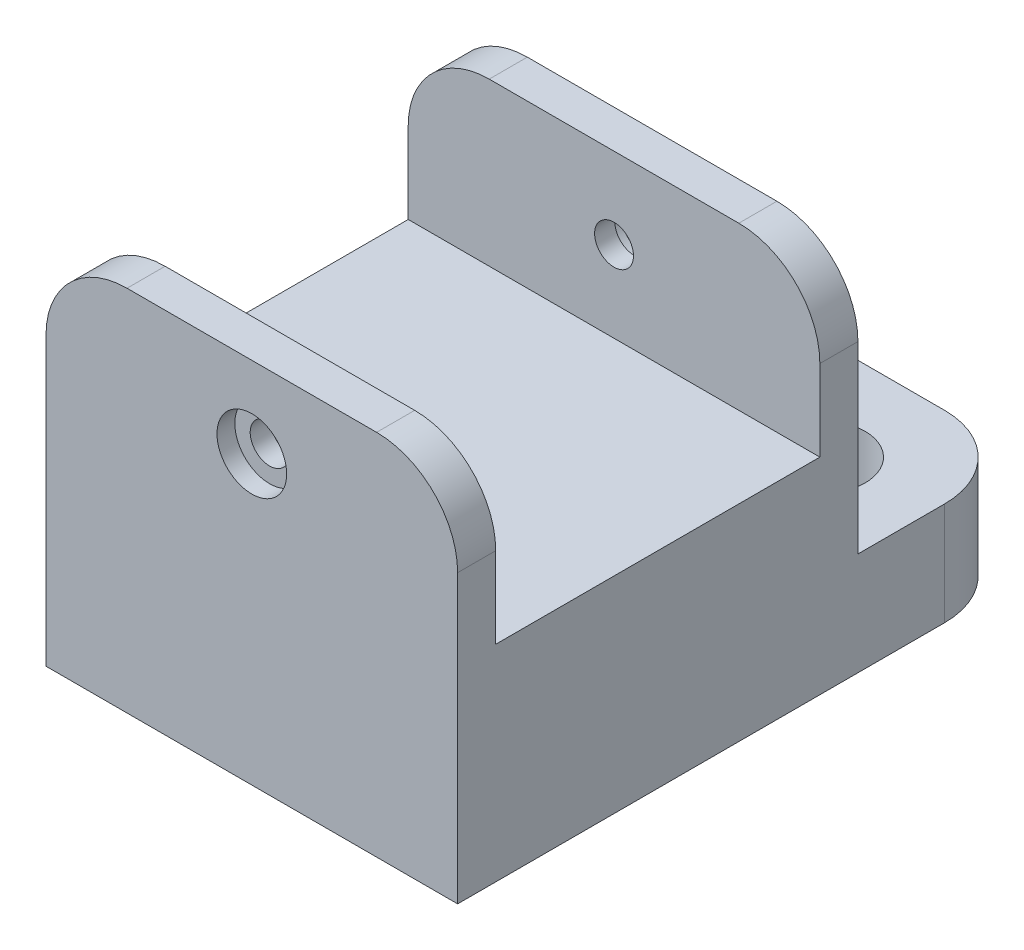
ISO-10303-21;
HEADER;
FILE_DESCRIPTION(('STEP AP214'),'2;1');
FILE_NAME('part.step','',(''),(''),'','','');
FILE_SCHEMA(('AUTOMOTIVE_DESIGN { 1 0 10303 214 1 1 1 1 }'));
ENDSEC;
DATA;
#1=APPLICATION_CONTEXT('core data for automotive mechanical design processes');
#2=APPLICATION_PROTOCOL_DEFINITION('international standard','automotive_design',2000,#1);
#3=PRODUCT_CONTEXT('',#1,'mechanical');
#4=PRODUCT('Part','Part','',(#3));
#5=PRODUCT_RELATED_PRODUCT_CATEGORY('part','',(#4));
#6=PRODUCT_DEFINITION_FORMATION('','',#4);
#7=PRODUCT_DEFINITION_CONTEXT('part definition',#1,'design');
#8=PRODUCT_DEFINITION('design','',#6,#7);
#9=PRODUCT_DEFINITION_SHAPE('','',#8);
#10=(LENGTH_UNIT() NAMED_UNIT(*) SI_UNIT(.MILLI.,.METRE.));
#11=(NAMED_UNIT(*) PLANE_ANGLE_UNIT() SI_UNIT($,.RADIAN.));
#12=(NAMED_UNIT(*) SI_UNIT($,.STERADIAN.) SOLID_ANGLE_UNIT());
#13=UNCERTAINTY_MEASURE_WITH_UNIT(LENGTH_MEASURE(1.E-05),#10,'distance_accuracy_value','');
#14=(GEOMETRIC_REPRESENTATION_CONTEXT(3) GLOBAL_UNCERTAINTY_ASSIGNED_CONTEXT((#13)) GLOBAL_UNIT_ASSIGNED_CONTEXT((#10,
#11,#12)) REPRESENTATION_CONTEXT('',''));
#15=CARTESIAN_POINT('',(0.,0.,0.));
#16=DIRECTION('',(0.,0.,1.));
#17=DIRECTION('',(1.,0.,0.));
#18=AXIS2_PLACEMENT_3D('',#15,#16,#17);
#19=CARTESIAN_POINT('',(-23.0844319775596,25.4,-20.5907433380084));
#20=DIRECTION('',(0.,0.,1.));
#21=DIRECTION('',(1.,0.,0.));
#22=AXIS2_PLACEMENT_3D('',#19,#20,#21);
#23=PLANE('',#22);
#24=CARTESIAN_POINT('',(2.3155680224404,35.4,-20.5907433380084));
#25=DIRECTION('',(0.,0.,1.));
#26=DIRECTION('',(1.,0.,0.));
#27=AXIS2_PLACEMENT_3D('',#24,#25,#26);
#28=CIRCLE('',#27,2.4);
#29=CARTESIAN_POINT('',(4.7155680224404,35.4,-20.5907433380084));
#30=VERTEX_POINT('',#29);
#31=EDGE_CURVE('E203',#30,#30,#28,.T.);
#32=ORIENTED_EDGE('',*,*,#31,.T.);
#33=EDGE_LOOP('',(#32));
#34=FACE_BOUND('',#33,.T.);
#35=DIRECTION('',(1.,0.,0.));
#36=VECTOR('',#35,1.);
#37=CARTESIAN_POINT('',(-23.0844319775596,25.4,-20.5907433380084));
#38=LINE('',#37,#36);
#39=CARTESIAN_POINT('',(-23.0844319775596,25.4,-20.5907433380084));
#40=VERTEX_POINT('',#39);
#41=CARTESIAN_POINT('',(27.7155680224404,25.4,-20.5907433380084));
#42=VERTEX_POINT('',#41);
#43=EDGE_CURVE('E49',#40,#42,#38,.T.);
#44=ORIENTED_EDGE('',*,*,#43,.F.);
#45=DIRECTION('',(0.,-1.,0.));
#46=VECTOR('',#45,1.);
#47=CARTESIAN_POINT('',(-23.0844319775596,25.4,-20.5907433380084));
#48=LINE('',#47,#46);
#49=CARTESIAN_POINT('',(-23.0844319775596,35.4,-20.5907433380084));
#50=VERTEX_POINT('',#49);
#51=EDGE_CURVE('E172',#50,#40,#48,.T.);
#52=ORIENTED_EDGE('',*,*,#51,.F.);
#53=CARTESIAN_POINT('',(-13.0844319775596,35.4,-20.5907433380084));
#54=DIRECTION('',(0.,0.,1.));
#55=DIRECTION('',(1.,0.,0.));
#56=AXIS2_PLACEMENT_3D('',#53,#54,#55);
#57=CIRCLE('',#56,10.);
#58=CARTESIAN_POINT('',(-13.0844319775596,45.4,-20.5907433380084));
#59=VERTEX_POINT('',#58);
#60=EDGE_CURVE('E42',#50,#59,#57,.F.);
#61=ORIENTED_EDGE('',*,*,#60,.T.);
#62=DIRECTION('',(-1.,0.,0.));
#63=VECTOR('',#62,1.);
#64=CARTESIAN_POINT('',(27.7155680224404,45.4,-20.5907433380084));
#65=LINE('',#64,#63);
#66=CARTESIAN_POINT('',(17.7155680224404,45.4,-20.5907433380084));
#67=VERTEX_POINT('',#66);
#68=EDGE_CURVE('E195',#67,#59,#65,.T.);
#69=ORIENTED_EDGE('',*,*,#68,.F.);
#70=CARTESIAN_POINT('',(17.7155680224404,35.4,-20.5907433380084));
#71=DIRECTION('',(0.,0.,1.));
#72=DIRECTION('',(1.,0.,0.));
#73=AXIS2_PLACEMENT_3D('',#70,#71,#72);
#74=CIRCLE('',#73,10.);
#75=CARTESIAN_POINT('',(27.7155680224404,35.4,-20.5907433380084));
#76=VERTEX_POINT('',#75);
#77=EDGE_CURVE('E55',#67,#76,#74,.F.);
#78=ORIENTED_EDGE('',*,*,#77,.T.);
#79=DIRECTION('',(0.,-1.,0.));
#80=VECTOR('',#79,1.);
#81=CARTESIAN_POINT('',(27.7155680224404,25.4,-20.5907433380084));
#82=LINE('',#81,#80);
#83=EDGE_CURVE('E175',#76,#42,#82,.T.);
#84=ORIENTED_EDGE('',*,*,#83,.T.);
#85=EDGE_LOOP('',(#44,#52,#61,#69,#78,#84));
#86=FACE_BOUND('',#85,.T.);
#87=ADVANCED_FACE('F34',(#34,#86),#23,.F.);
#88=CARTESIAN_POINT('',(-23.0844319775596,25.4,-20.5907433380084));
#89=DIRECTION('',(1.,0.,0.));
#90=DIRECTION('',(0.,0.,-1.));
#91=AXIS2_PLACEMENT_3D('',#88,#89,#90);
#92=PLANE('',#91);
#93=DIRECTION('',(0.,0.,1.));
#94=VECTOR('',#93,1.);
#95=CARTESIAN_POINT('',(-23.0844319775596,0.,-20.5907433380084));
#96=LINE('',#95,#94);
#97=CARTESIAN_POINT('',(-23.0844319775596,0.,-75.9907433380084));
#98=VERTEX_POINT('',#97);
#99=CARTESIAN_POINT('',(-23.0844319775596,0.,-15.8907433380084));
#100=VERTEX_POINT('',#99);
#101=EDGE_CURVE('E173',#98,#100,#96,.T.);
#102=ORIENTED_EDGE('',*,*,#101,.T.);
#103=DIRECTION('',(0.,-1.,0.));
#104=VECTOR('',#103,1.);
#105=CARTESIAN_POINT('',(-23.0844319775596,45.4,-15.8907433380084));
#106=LINE('',#105,#104);
#107=CARTESIAN_POINT('',(-23.0844319775596,35.4,-15.8907433380084));
#108=VERTEX_POINT('',#107);
#109=EDGE_CURVE('E155',#108,#100,#106,.T.);
#110=ORIENTED_EDGE('',*,*,#109,.F.);
#111=DIRECTION('',(0.,0.,1.));
#112=VECTOR('',#111,1.);
#113=CARTESIAN_POINT('',(-23.0844319775596,35.4,-20.5907433380084));
#114=LINE('',#113,#112);
#115=EDGE_CURVE('E191',#108,#50,#114,.F.);
#116=ORIENTED_EDGE('',*,*,#115,.T.);
#117=ORIENTED_EDGE('',*,*,#51,.T.);
#118=DIRECTION('',(0.,0.,1.));
#119=VECTOR('',#118,1.);
#120=CARTESIAN_POINT('',(-23.0844319775596,25.4,-40.5907433380084));
#121=LINE('',#120,#119);
#122=CARTESIAN_POINT('',(-23.0844319775596,25.4,-60.5907433380084));
#123=VERTEX_POINT('',#122);
#124=EDGE_CURVE('E222',#123,#40,#121,.T.);
#125=ORIENTED_EDGE('',*,*,#124,.F.);
#126=DIRECTION('',(0.,-1.,0.));
#127=VECTOR('',#126,1.);
#128=CARTESIAN_POINT('',(-23.0844319775596,25.4,-60.5907433380084));
#129=LINE('',#128,#127);
#130=CARTESIAN_POINT('',(-23.0844319775596,35.4,-60.5907433380084));
#131=VERTEX_POINT('',#130);
#132=EDGE_CURVE('E270',#131,#123,#129,.T.);
#133=ORIENTED_EDGE('',*,*,#132,.F.);
#134=DIRECTION('',(0.,0.,-1.));
#135=VECTOR('',#134,1.);
#136=CARTESIAN_POINT('',(-23.0844319775596,35.4,-60.5907433380084));
#137=LINE('',#136,#135);
#138=CARTESIAN_POINT('',(-23.0844319775596,35.4,-65.2907433380084));
#139=VERTEX_POINT('',#138);
#140=EDGE_CURVE('E253',#139,#131,#137,.F.);
#141=ORIENTED_EDGE('',*,*,#140,.F.);
#142=DIRECTION('',(0.,-1.,0.));
#143=VECTOR('',#142,1.);
#144=CARTESIAN_POINT('',(-23.0844319775596,45.4,-65.2907433380084));
#145=LINE('',#144,#143);
#146=CARTESIAN_POINT('',(-23.0844319775596,12.7,-65.2907433380084));
#147=VERTEX_POINT('',#146);
#148=EDGE_CURVE('E293',#139,#147,#145,.T.);
#149=ORIENTED_EDGE('',*,*,#148,.T.);
#150=DIRECTION('',(0.,0.,-1.));
#151=VECTOR('',#150,1.);
#152=CARTESIAN_POINT('',(-23.0844319775596,12.7,-65.2907433380084));
#153=LINE('',#152,#151);
#154=CARTESIAN_POINT('',(-23.0844319775596,12.7,-75.9907433380084));
#155=VERTEX_POINT('',#154);
#156=EDGE_CURVE('E165',#147,#155,#153,.T.);
#157=ORIENTED_EDGE('',*,*,#156,.T.);
#158=DIRECTION('',(0.,-1.,0.));
#159=VECTOR('',#158,1.);
#160=CARTESIAN_POINT('',(-23.0844319775596,25.4,-75.9907433380084));
#161=LINE('',#160,#159);
#162=EDGE_CURVE('E255',#98,#155,#161,.F.);
#163=ORIENTED_EDGE('',*,*,#162,.F.);
#164=EDGE_LOOP('',(#102,#110,#116,#117,#125,#133,#141,#149,#157,#163));
#165=FACE_BOUND('',#164,.T.);
#166=ADVANCED_FACE('F207',(#165),#92,.F.);
#167=CARTESIAN_POINT('',(27.7155680224404,25.4,-20.5907433380084));
#168=DIRECTION('',(-1.,0.,0.));
#169=DIRECTION('',(0.,0.,1.));
#170=AXIS2_PLACEMENT_3D('',#167,#168,#169);
#171=PLANE('',#170);
#172=DIRECTION('',(0.,-1.,0.));
#173=VECTOR('',#172,1.);
#174=CARTESIAN_POINT('',(27.7155680224404,45.4,-15.8907433380084));
#175=LINE('',#174,#173);
#176=CARTESIAN_POINT('',(27.7155680224404,35.4,-15.8907433380084));
#177=VERTEX_POINT('',#176);
#178=CARTESIAN_POINT('',(27.7155680224404,0.,-15.8907433380084));
#179=VERTEX_POINT('',#178);
#180=EDGE_CURVE('E145',#177,#179,#175,.T.);
#181=ORIENTED_EDGE('',*,*,#180,.T.);
#182=DIRECTION('',(0.,0.,-1.));
#183=VECTOR('',#182,1.);
#184=CARTESIAN_POINT('',(27.7155680224404,0.,-20.5907433380084));
#185=LINE('',#184,#183);
#186=CARTESIAN_POINT('',(27.7155680224404,0.,-75.9907433380084));
#187=VERTEX_POINT('',#186);
#188=EDGE_CURVE('E150',#179,#187,#185,.T.);
#189=ORIENTED_EDGE('',*,*,#188,.T.);
#190=DIRECTION('',(0.,-1.,0.));
#191=VECTOR('',#190,1.);
#192=CARTESIAN_POINT('',(27.7155680224404,25.4,-75.9907433380084));
#193=LINE('',#192,#191);
#194=CARTESIAN_POINT('',(27.7155680224404,12.7,-75.9907433380084));
#195=VERTEX_POINT('',#194);
#196=EDGE_CURVE('E245',#195,#187,#193,.T.);
#197=ORIENTED_EDGE('',*,*,#196,.F.);
#198=DIRECTION('',(0.,0.,1.));
#199=VECTOR('',#198,1.);
#200=CARTESIAN_POINT('',(27.7155680224404,12.7,-60.5907433380084));
#201=LINE('',#200,#199);
#202=CARTESIAN_POINT('',(27.7155680224404,12.7,-65.2907433380084));
#203=VERTEX_POINT('',#202);
#204=EDGE_CURVE('E326',#195,#203,#201,.T.);
#205=ORIENTED_EDGE('',*,*,#204,.T.);
#206=DIRECTION('',(0.,-1.,0.));
#207=VECTOR('',#206,1.);
#208=CARTESIAN_POINT('',(27.7155680224404,45.4,-65.2907433380084));
#209=LINE('',#208,#207);
#210=CARTESIAN_POINT('',(27.7155680224404,35.4,-65.2907433380084));
#211=VERTEX_POINT('',#210);
#212=EDGE_CURVE('E296',#211,#203,#209,.T.);
#213=ORIENTED_EDGE('',*,*,#212,.F.);
#214=DIRECTION('',(0.,0.,1.));
#215=VECTOR('',#214,1.);
#216=CARTESIAN_POINT('',(27.7155680224404,35.4,-60.5907433380084));
#217=LINE('',#216,#215);
#218=CARTESIAN_POINT('',(27.7155680224404,35.4,-60.5907433380084));
#219=VERTEX_POINT('',#218);
#220=EDGE_CURVE('E242',#219,#211,#217,.F.);
#221=ORIENTED_EDGE('',*,*,#220,.F.);
#222=DIRECTION('',(0.,-1.,0.));
#223=VECTOR('',#222,1.);
#224=CARTESIAN_POINT('',(27.7155680224404,25.4,-60.5907433380084));
#225=LINE('',#224,#223);
#226=CARTESIAN_POINT('',(27.7155680224404,25.4,-60.5907433380084));
#227=VERTEX_POINT('',#226);
#228=EDGE_CURVE('E267',#219,#227,#225,.T.);
#229=ORIENTED_EDGE('',*,*,#228,.T.);
#230=DIRECTION('',(0.,0.,1.));
#231=VECTOR('',#230,1.);
#232=CARTESIAN_POINT('',(27.7155680224404,25.4,-40.5907433380084));
#233=LINE('',#232,#231);
#234=EDGE_CURVE('E225',#227,#42,#233,.T.);
#235=ORIENTED_EDGE('',*,*,#234,.T.);
#236=ORIENTED_EDGE('',*,*,#83,.F.);
#237=DIRECTION('',(0.,0.,-1.));
#238=VECTOR('',#237,1.);
#239=CARTESIAN_POINT('',(27.7155680224404,35.4,-20.5907433380084));
#240=LINE('',#239,#238);
#241=EDGE_CURVE('E11',#76,#177,#240,.F.);
#242=ORIENTED_EDGE('',*,*,#241,.T.);
#243=EDGE_LOOP('',(#181,#189,#197,#205,#213,#221,#229,#235,#236,#242));
#244=FACE_BOUND('',#243,.T.);
#245=ADVANCED_FACE('F147',(#244),#171,.F.);
#246=CARTESIAN_POINT('',(0.,0.,0.));
#247=DIRECTION('',(0.,1.,0.));
#248=DIRECTION('',(0.,0.,1.));
#249=AXIS2_PLACEMENT_3D('',#246,#247,#248);
#250=PLANE('',#249);
#251=ORIENTED_EDGE('',*,*,#188,.F.);
#252=DIRECTION('',(1.,0.,0.));
#253=VECTOR('',#252,1.);
#254=CARTESIAN_POINT('',(-23.0844319775596,0.,-15.8907433380084));
#255=LINE('',#254,#253);
#256=EDGE_CURVE('E159',#100,#179,#255,.T.);
#257=ORIENTED_EDGE('',*,*,#256,.F.);
#258=ORIENTED_EDGE('',*,*,#101,.F.);
#259=CARTESIAN_POINT('',(-13.0844319775596,0.,-75.9907433380084));
#260=DIRECTION('',(0.,-1.,0.));
#261=DIRECTION('',(0.,0.,-1.));
#262=AXIS2_PLACEMENT_3D('',#259,#260,#261);
#263=CIRCLE('',#262,10.);
#264=CARTESIAN_POINT('',(-13.0844319775596,0.,-85.9907433380084));
#265=VERTEX_POINT('',#264);
#266=EDGE_CURVE('E239',#265,#98,#263,.F.);
#267=ORIENTED_EDGE('',*,*,#266,.F.);
#268=DIRECTION('',(1.,0.,0.));
#269=VECTOR('',#268,1.);
#270=CARTESIAN_POINT('',(-23.0844319775596,0.,-85.9907433380084));
#271=LINE('',#270,#269);
#272=CARTESIAN_POINT('',(17.7155680224404,0.,-85.9907433380084));
#273=VERTEX_POINT('',#272);
#274=EDGE_CURVE('E273',#265,#273,#271,.T.);
#275=ORIENTED_EDGE('',*,*,#274,.T.);
#276=CARTESIAN_POINT('',(17.7155680224404,0.,-75.9907433380084));
#277=DIRECTION('',(0.,-1.,0.));
#278=DIRECTION('',(0.,0.,-1.));
#279=AXIS2_PLACEMENT_3D('',#276,#277,#278);
#280=CIRCLE('',#279,10.);
#281=EDGE_CURVE('E170',#187,#273,#280,.F.);
#282=ORIENTED_EDGE('',*,*,#281,.F.);
#283=EDGE_LOOP('',(#251,#257,#258,#267,#275,#282));
#284=FACE_BOUND('',#283,.T.);
#285=CARTESIAN_POINT('',(-10.3844319775596,0.,-73.2907433380084));
#286=DIRECTION('',(0.,-1.,0.));
#287=DIRECTION('',(0.,0.,-1.));
#288=AXIS2_PLACEMENT_3D('',#285,#286,#287);
#289=CIRCLE('',#288,3.37819999999999);
#290=CARTESIAN_POINT('',(-10.3844319775596,0.,-76.6689433380084));
#291=VERTEX_POINT('',#290);
#292=EDGE_CURVE('E284',#291,#291,#289,.T.);
#293=ORIENTED_EDGE('',*,*,#292,.F.);
#294=EDGE_LOOP('',(#293));
#295=FACE_BOUND('',#294,.T.);
#296=CARTESIAN_POINT('',(15.0155680224404,0.,-73.2907433380084));
#297=DIRECTION('',(0.,-1.,0.));
#298=DIRECTION('',(0.,0.,-1.));
#299=AXIS2_PLACEMENT_3D('',#296,#297,#298);
#300=CIRCLE('',#299,3.37819999999999);
#301=CARTESIAN_POINT('',(15.0155680224404,0.,-76.6689433380084));
#302=VERTEX_POINT('',#301);
#303=EDGE_CURVE('E275',#302,#302,#300,.T.);
#304=ORIENTED_EDGE('',*,*,#303,.F.);
#305=EDGE_LOOP('',(#304));
#306=FACE_BOUND('',#305,.T.);
#307=ADVANCED_FACE('F167',(#284,#295,#306),#250,.F.);
#308=CARTESIAN_POINT('',(27.7155680224404,45.4,-15.8907433380084));
#309=DIRECTION('',(0.,0.,-1.));
#310=DIRECTION('',(-1.,0.,0.));
#311=AXIS2_PLACEMENT_3D('',#308,#309,#310);
#312=PLANE('',#311);
#313=CARTESIAN_POINT('',(2.3155680224404,35.4,-15.8907433380084));
#314=DIRECTION('',(0.,0.,1.));
#315=DIRECTION('',(1.,0.,0.));
#316=AXIS2_PLACEMENT_3D('',#313,#314,#315);
#317=CIRCLE('',#316,4.3);
#318=CARTESIAN_POINT('',(6.6155680224404,35.4,-15.8907433380084));
#319=VERTEX_POINT('',#318);
#320=EDGE_CURVE('E219',#319,#319,#317,.T.);
#321=ORIENTED_EDGE('',*,*,#320,.F.);
#322=EDGE_LOOP('',(#321));
#323=FACE_BOUND('',#322,.T.);
#324=DIRECTION('',(1.,0.,0.));
#325=VECTOR('',#324,1.);
#326=CARTESIAN_POINT('',(27.7155680224404,45.4,-15.8907433380084));
#327=LINE('',#326,#325);
#328=CARTESIAN_POINT('',(-13.0844319775596,45.4,-15.8907433380084));
#329=VERTEX_POINT('',#328);
#330=CARTESIAN_POINT('',(17.7155680224404,45.4,-15.8907433380084));
#331=VERTEX_POINT('',#330);
#332=EDGE_CURVE('E156',#329,#331,#327,.T.);
#333=ORIENTED_EDGE('',*,*,#332,.F.);
#334=CARTESIAN_POINT('',(-13.0844319775596,35.4,-15.8907433380084));
#335=DIRECTION('',(0.,0.,-1.));
#336=DIRECTION('',(-1.,0.,0.));
#337=AXIS2_PLACEMENT_3D('',#334,#335,#336);
#338=CIRCLE('',#337,10.);
#339=EDGE_CURVE('E189',#329,#108,#338,.F.);
#340=ORIENTED_EDGE('',*,*,#339,.T.);
#341=ORIENTED_EDGE('',*,*,#109,.T.);
#342=ORIENTED_EDGE('',*,*,#256,.T.);
#343=ORIENTED_EDGE('',*,*,#180,.F.);
#344=CARTESIAN_POINT('',(17.7155680224404,35.4,-15.8907433380084));
#345=DIRECTION('',(0.,0.,-1.));
#346=DIRECTION('',(-1.,0.,0.));
#347=AXIS2_PLACEMENT_3D('',#344,#345,#346);
#348=CIRCLE('',#347,10.);
#349=EDGE_CURVE('E187',#177,#331,#348,.F.);
#350=ORIENTED_EDGE('',*,*,#349,.T.);
#351=EDGE_LOOP('',(#333,#340,#341,#342,#343,#350));
#352=FACE_BOUND('',#351,.T.);
#353=ADVANCED_FACE('F161',(#323,#352),#312,.F.);
#354=CARTESIAN_POINT('',(0.,45.4,0.));
#355=DIRECTION('',(0.,-1.,0.));
#356=DIRECTION('',(0.,0.,-1.));
#357=AXIS2_PLACEMENT_3D('',#354,#355,#356);
#358=PLANE('',#357);
#359=ORIENTED_EDGE('',*,*,#68,.T.);
#360=DIRECTION('',(0.,0.,1.));
#361=VECTOR('',#360,1.);
#362=CARTESIAN_POINT('',(-13.0844319775596,45.4,0.));
#363=LINE('',#362,#361);
#364=EDGE_CURVE('E184',#59,#329,#363,.T.);
#365=ORIENTED_EDGE('',*,*,#364,.T.);
#366=ORIENTED_EDGE('',*,*,#332,.T.);
#367=DIRECTION('',(0.,0.,-1.));
#368=VECTOR('',#367,1.);
#369=CARTESIAN_POINT('',(17.7155680224404,45.4,0.));
#370=LINE('',#369,#368);
#371=EDGE_CURVE('E181',#331,#67,#370,.T.);
#372=ORIENTED_EDGE('',*,*,#371,.T.);
#373=EDGE_LOOP('',(#359,#365,#366,#372));
#374=FACE_BOUND('',#373,.T.);
#375=ADVANCED_FACE('F200',(#374),#358,.F.);
#376=CARTESIAN_POINT('',(2.3155680224404,35.4,-15.8907433380084));
#377=DIRECTION('',(0.,0.,1.));
#378=DIRECTION('',(1.,0.,0.));
#379=AXIS2_PLACEMENT_3D('',#376,#377,#378);
#380=CYLINDRICAL_SURFACE('',#379,2.4);
#381=ORIENTED_EDGE('',*,*,#31,.F.);
#382=EDGE_LOOP('',(#381));
#383=FACE_BOUND('',#382,.T.);
#384=CARTESIAN_POINT('',(2.3155680224404,35.4,-18.0907433380084));
#385=DIRECTION('',(0.,0.,1.));
#386=DIRECTION('',(1.,0.,0.));
#387=AXIS2_PLACEMENT_3D('',#384,#385,#386);
#388=CIRCLE('',#387,2.4);
#389=CARTESIAN_POINT('',(4.7155680224404,35.4,-18.0907433380084));
#390=VERTEX_POINT('',#389);
#391=EDGE_CURVE('E213',#390,#390,#388,.T.);
#392=ORIENTED_EDGE('',*,*,#391,.T.);
#393=EDGE_LOOP('',(#392));
#394=FACE_BOUND('',#393,.T.);
#395=ADVANCED_FACE('F412',(#383,#394),#380,.F.);
#396=CARTESIAN_POINT('',(4.7155680224404,35.4,-18.0907433380084));
#397=DIRECTION('',(0.,0.,-1.));
#398=DIRECTION('',(-1.,0.,0.));
#399=AXIS2_PLACEMENT_3D('',#396,#397,#398);
#400=PLANE('',#399);
#401=ORIENTED_EDGE('',*,*,#391,.F.);
#402=EDGE_LOOP('',(#401));
#403=FACE_BOUND('',#402,.T.);
#404=CARTESIAN_POINT('',(2.3155680224404,35.4,-18.0907433380084));
#405=DIRECTION('',(0.,0.,1.));
#406=DIRECTION('',(1.,0.,0.));
#407=AXIS2_PLACEMENT_3D('',#404,#405,#406);
#408=CIRCLE('',#407,4.3);
#409=CARTESIAN_POINT('',(6.6155680224404,35.4,-18.0907433380084));
#410=VERTEX_POINT('',#409);
#411=EDGE_CURVE('E216',#410,#410,#408,.T.);
#412=ORIENTED_EDGE('',*,*,#411,.T.);
#413=EDGE_LOOP('',(#412));
#414=FACE_BOUND('',#413,.T.);
#415=ADVANCED_FACE('F406',(#403,#414),#400,.F.);
#416=CARTESIAN_POINT('',(2.3155680224404,35.4,-15.8907433380084));
#417=DIRECTION('',(0.,0.,1.));
#418=DIRECTION('',(1.,0.,0.));
#419=AXIS2_PLACEMENT_3D('',#416,#417,#418);
#420=CYLINDRICAL_SURFACE('',#419,4.3);
#421=ORIENTED_EDGE('',*,*,#411,.F.);
#422=EDGE_LOOP('',(#421));
#423=FACE_BOUND('',#422,.T.);
#424=ORIENTED_EDGE('',*,*,#320,.T.);
#425=EDGE_LOOP('',(#424));
#426=FACE_BOUND('',#425,.T.);
#427=ADVANCED_FACE('F400',(#423,#426),#420,.F.);
#428=CARTESIAN_POINT('',(-13.0844319775596,35.4,0.));
#429=DIRECTION('',(0.,0.,1.));
#430=DIRECTION('',(1.,0.,0.));
#431=AXIS2_PLACEMENT_3D('',#428,#429,#430);
#432=CYLINDRICAL_SURFACE('',#431,10.);
#433=ORIENTED_EDGE('',*,*,#60,.F.);
#434=ORIENTED_EDGE('',*,*,#115,.F.);
#435=ORIENTED_EDGE('',*,*,#339,.F.);
#436=ORIENTED_EDGE('',*,*,#364,.F.);
#437=EDGE_LOOP('',(#433,#434,#435,#436));
#438=FACE_BOUND('',#437,.T.);
#439=ADVANCED_FACE('F205',(#438),#432,.T.);
#440=CARTESIAN_POINT('',(17.7155680224404,35.4,0.));
#441=DIRECTION('',(0.,0.,-1.));
#442=DIRECTION('',(-1.,0.,0.));
#443=AXIS2_PLACEMENT_3D('',#440,#441,#442);
#444=CYLINDRICAL_SURFACE('',#443,10.);
#445=ORIENTED_EDGE('',*,*,#349,.F.);
#446=ORIENTED_EDGE('',*,*,#241,.F.);
#447=ORIENTED_EDGE('',*,*,#77,.F.);
#448=ORIENTED_EDGE('',*,*,#371,.F.);
#449=EDGE_LOOP('',(#445,#446,#447,#448));
#450=FACE_BOUND('',#449,.T.);
#451=ADVANCED_FACE('F36',(#450),#444,.T.);
#452=CARTESIAN_POINT('',(-23.0844319775596,25.4,-40.5907433380084));
#453=DIRECTION('',(0.,-1.,0.));
#454=DIRECTION('',(1.,0.,0.));
#455=AXIS2_PLACEMENT_3D('',#452,#453,#454);
#456=PLANE('',#455);
#457=ORIENTED_EDGE('',*,*,#43,.T.);
#458=ORIENTED_EDGE('',*,*,#234,.F.);
#459=DIRECTION('',(1.,0.,0.));
#460=VECTOR('',#459,1.);
#461=CARTESIAN_POINT('',(-23.0844319775596,25.4,-60.5907433380084));
#462=LINE('',#461,#460);
#463=EDGE_CURVE('E317',#123,#227,#462,.T.);
#464=ORIENTED_EDGE('',*,*,#463,.F.);
#465=ORIENTED_EDGE('',*,*,#124,.T.);
#466=EDGE_LOOP('',(#457,#458,#464,#465));
#467=FACE_BOUND('',#466,.T.);
#468=ADVANCED_FACE('F368',(#467),#456,.F.);
#469=CARTESIAN_POINT('',(-23.0844319775596,25.4,-85.9907433380084));
#470=DIRECTION('',(0.,0.,1.));
#471=DIRECTION('',(-1.,0.,0.));
#472=AXIS2_PLACEMENT_3D('',#469,#470,#471);
#473=PLANE('',#472);
#474=DIRECTION('',(1.,0.,0.));
#475=VECTOR('',#474,1.);
#476=CARTESIAN_POINT('',(-23.0844319775596,12.7,-85.9907433380084));
#477=LINE('',#476,#475);
#478=CARTESIAN_POINT('',(-13.0844319775596,12.7,-85.9907433380084));
#479=VERTEX_POINT('',#478);
#480=CARTESIAN_POINT('',(17.7155680224404,12.7,-85.9907433380084));
#481=VERTEX_POINT('',#480);
#482=EDGE_CURVE('E331',#479,#481,#477,.T.);
#483=ORIENTED_EDGE('',*,*,#482,.T.);
#484=DIRECTION('',(0.,-1.,0.));
#485=VECTOR('',#484,1.);
#486=CARTESIAN_POINT('',(17.7155680224404,25.4,-85.9907433380084));
#487=LINE('',#486,#485);
#488=EDGE_CURVE('E232',#273,#481,#487,.F.);
#489=ORIENTED_EDGE('',*,*,#488,.F.);
#490=ORIENTED_EDGE('',*,*,#274,.F.);
#491=DIRECTION('',(0.,-1.,0.));
#492=VECTOR('',#491,1.);
#493=CARTESIAN_POINT('',(-13.0844319775596,25.4,-85.9907433380084));
#494=LINE('',#493,#492);
#495=EDGE_CURVE('E235',#479,#265,#494,.T.);
#496=ORIENTED_EDGE('',*,*,#495,.F.);
#497=EDGE_LOOP('',(#483,#489,#490,#496));
#498=FACE_BOUND('',#497,.T.);
#499=ADVANCED_FACE('F349',(#498),#473,.F.);
#500=CARTESIAN_POINT('',(15.0155680224404,25.4,-73.2907433380084));
#501=DIRECTION('',(0.,1.,0.));
#502=DIRECTION('',(0.,0.,-1.));
#503=AXIS2_PLACEMENT_3D('',#500,#501,#502);
#504=CYLINDRICAL_SURFACE('',#503,5.55625);
#505=CARTESIAN_POINT('',(15.0155680224404,6.35,-73.2907433380084));
#506=DIRECTION('',(0.,-1.,0.));
#507=DIRECTION('',(0.,0.,-1.));
#508=AXIS2_PLACEMENT_3D('',#505,#506,#507);
#509=CIRCLE('',#508,5.55625);
#510=CARTESIAN_POINT('',(15.0155680224404,6.35,-78.8469933380084));
#511=VERTEX_POINT('',#510);
#512=EDGE_CURVE('E281',#511,#511,#509,.T.);
#513=ORIENTED_EDGE('',*,*,#512,.T.);
#514=EDGE_LOOP('',(#513));
#515=FACE_BOUND('',#514,.T.);
#516=CARTESIAN_POINT('',(15.0155680224404,12.7,-73.2907433380084));
#517=DIRECTION('',(0.,-1.,0.));
#518=DIRECTION('',(0.,0.,-1.));
#519=AXIS2_PLACEMENT_3D('',#516,#517,#518);
#520=CIRCLE('',#519,5.55625);
#521=CARTESIAN_POINT('',(15.0155680224404,12.7,-78.8469933380084));
#522=VERTEX_POINT('',#521);
#523=EDGE_CURVE('E320',#522,#522,#520,.F.);
#524=ORIENTED_EDGE('',*,*,#523,.T.);
#525=EDGE_LOOP('',(#524));
#526=FACE_BOUND('',#525,.T.);
#527=ADVANCED_FACE('F571',(#515,#526),#504,.F.);
#528=CARTESIAN_POINT('',(-10.3844319775596,25.4,-73.2907433380084));
#529=DIRECTION('',(0.,1.,0.));
#530=DIRECTION('',(0.,0.,-1.));
#531=AXIS2_PLACEMENT_3D('',#528,#529,#530);
#532=CYLINDRICAL_SURFACE('',#531,5.55625);
#533=CARTESIAN_POINT('',(-10.3844319775596,6.35,-73.2907433380084));
#534=DIRECTION('',(0.,-1.,0.));
#535=DIRECTION('',(0.,0.,-1.));
#536=AXIS2_PLACEMENT_3D('',#533,#534,#535);
#537=CIRCLE('',#536,5.55625);
#538=CARTESIAN_POINT('',(-10.3844319775596,6.35,-78.8469933380084));
#539=VERTEX_POINT('',#538);
#540=EDGE_CURVE('E290',#539,#539,#537,.T.);
#541=ORIENTED_EDGE('',*,*,#540,.T.);
#542=EDGE_LOOP('',(#541));
#543=FACE_BOUND('',#542,.T.);
#544=CARTESIAN_POINT('',(-10.3844319775596,12.7,-73.2907433380084));
#545=DIRECTION('',(0.,-1.,0.));
#546=DIRECTION('',(0.,0.,-1.));
#547=AXIS2_PLACEMENT_3D('',#544,#545,#546);
#548=CIRCLE('',#547,5.55625);
#549=CARTESIAN_POINT('',(-10.3844319775596,12.7,-78.8469933380084));
#550=VERTEX_POINT('',#549);
#551=EDGE_CURVE('E323',#550,#550,#548,.F.);
#552=ORIENTED_EDGE('',*,*,#551,.T.);
#553=EDGE_LOOP('',(#552));
#554=FACE_BOUND('',#553,.T.);
#555=ADVANCED_FACE('F562',(#543,#554),#532,.F.);
#556=CARTESIAN_POINT('',(17.7155680224404,25.4,-75.9907433380084));
#557=DIRECTION('',(0.,-1.,0.));
#558=DIRECTION('',(0.,0.,1.));
#559=AXIS2_PLACEMENT_3D('',#556,#557,#558);
#560=CYLINDRICAL_SURFACE('',#559,10.);
#561=ORIENTED_EDGE('',*,*,#196,.T.);
#562=ORIENTED_EDGE('',*,*,#281,.T.);
#563=ORIENTED_EDGE('',*,*,#488,.T.);
#564=CARTESIAN_POINT('',(17.7155680224404,12.7,-75.9907433380084));
#565=DIRECTION('',(0.,-1.,0.));
#566=DIRECTION('',(0.,0.,-1.));
#567=AXIS2_PLACEMENT_3D('',#564,#565,#566);
#568=CIRCLE('',#567,10.);
#569=EDGE_CURVE('E329',#195,#481,#568,.F.);
#570=ORIENTED_EDGE('',*,*,#569,.F.);
#571=EDGE_LOOP('',(#561,#562,#563,#570));
#572=FACE_BOUND('',#571,.T.);
#573=ADVANCED_FACE('F352',(#572),#560,.T.);
#574=CARTESIAN_POINT('',(-13.0844319775596,25.4,-75.9907433380084));
#575=DIRECTION('',(0.,-1.,0.));
#576=DIRECTION('',(0.,0.,1.));
#577=AXIS2_PLACEMENT_3D('',#574,#575,#576);
#578=CYLINDRICAL_SURFACE('',#577,10.);
#579=ORIENTED_EDGE('',*,*,#495,.T.);
#580=ORIENTED_EDGE('',*,*,#266,.T.);
#581=ORIENTED_EDGE('',*,*,#162,.T.);
#582=CARTESIAN_POINT('',(-13.0844319775596,12.7,-75.9907433380084));
#583=DIRECTION('',(0.,-1.,0.));
#584=DIRECTION('',(0.,0.,-1.));
#585=AXIS2_PLACEMENT_3D('',#582,#583,#584);
#586=CIRCLE('',#585,10.);
#587=EDGE_CURVE('E229',#479,#155,#586,.F.);
#588=ORIENTED_EDGE('',*,*,#587,.F.);
#589=EDGE_LOOP('',(#579,#580,#581,#588));
#590=FACE_BOUND('',#589,.T.);
#591=ADVANCED_FACE('F345',(#590),#578,.T.);
#592=CARTESIAN_POINT('',(-23.0844319775596,25.4,-60.5907433380084));
#593=DIRECTION('',(0.,0.,-1.));
#594=DIRECTION('',(1.,0.,0.));
#595=AXIS2_PLACEMENT_3D('',#592,#593,#594);
#596=PLANE('',#595);
#597=CARTESIAN_POINT('',(2.3155680224404,35.4,-60.5907433380084));
#598=DIRECTION('',(0.,0.,1.));
#599=DIRECTION('',(1.,0.,0.));
#600=AXIS2_PLACEMENT_3D('',#597,#598,#599);
#601=CIRCLE('',#600,2.4);
#602=CARTESIAN_POINT('',(4.7155680224404,35.4,-60.5907433380084));
#603=VERTEX_POINT('',#602);
#604=EDGE_CURVE('E305',#603,#603,#601,.T.);
#605=ORIENTED_EDGE('',*,*,#604,.F.);
#606=EDGE_LOOP('',(#605));
#607=FACE_BOUND('',#606,.T.);
#608=ORIENTED_EDGE('',*,*,#463,.T.);
#609=ORIENTED_EDGE('',*,*,#228,.F.);
#610=CARTESIAN_POINT('',(17.7155680224404,35.4,-60.5907433380084));
#611=DIRECTION('',(0.,0.,1.));
#612=DIRECTION('',(1.,0.,0.));
#613=AXIS2_PLACEMENT_3D('',#610,#611,#612);
#614=CIRCLE('',#613,10.);
#615=CARTESIAN_POINT('',(17.7155680224404,45.4,-60.5907433380084));
#616=VERTEX_POINT('',#615);
#617=EDGE_CURVE('E250',#616,#219,#614,.F.);
#618=ORIENTED_EDGE('',*,*,#617,.F.);
#619=DIRECTION('',(-1.,0.,0.));
#620=VECTOR('',#619,1.);
#621=CARTESIAN_POINT('',(27.7155680224404,45.4,-60.5907433380084));
#622=LINE('',#621,#620);
#623=CARTESIAN_POINT('',(-13.0844319775596,45.4,-60.5907433380084));
#624=VERTEX_POINT('',#623);
#625=EDGE_CURVE('E302',#616,#624,#622,.T.);
#626=ORIENTED_EDGE('',*,*,#625,.T.);
#627=CARTESIAN_POINT('',(-13.0844319775596,35.4,-60.5907433380084));
#628=DIRECTION('',(0.,0.,1.));
#629=DIRECTION('',(1.,0.,0.));
#630=AXIS2_PLACEMENT_3D('',#627,#628,#629);
#631=CIRCLE('',#630,10.);
#632=EDGE_CURVE('E247',#131,#624,#631,.F.);
#633=ORIENTED_EDGE('',*,*,#632,.F.);
#634=ORIENTED_EDGE('',*,*,#132,.T.);
#635=EDGE_LOOP('',(#608,#609,#618,#626,#633,#634));
#636=FACE_BOUND('',#635,.T.);
#637=ADVANCED_FACE('F364',(#607,#636),#596,.F.);
#638=CARTESIAN_POINT('',(15.0155680224404,25.4,-73.2907433380084));
#639=DIRECTION('',(0.,1.,0.));
#640=DIRECTION('',(0.,0.,-1.));
#641=AXIS2_PLACEMENT_3D('',#638,#639,#640);
#642=CYLINDRICAL_SURFACE('',#641,3.37819999999999);
#643=ORIENTED_EDGE('',*,*,#303,.T.);
#644=EDGE_LOOP('',(#643));
#645=FACE_BOUND('',#644,.T.);
#646=CARTESIAN_POINT('',(15.0155680224404,6.35,-73.2907433380084));
#647=DIRECTION('',(0.,-1.,0.));
#648=DIRECTION('',(0.,0.,-1.));
#649=AXIS2_PLACEMENT_3D('',#646,#647,#648);
#650=CIRCLE('',#649,3.3782);
#651=CARTESIAN_POINT('',(15.0155680224404,6.35,-76.6689433380084));
#652=VERTEX_POINT('',#651);
#653=EDGE_CURVE('E278',#652,#652,#650,.T.);
#654=ORIENTED_EDGE('',*,*,#653,.F.);
#655=EDGE_LOOP('',(#654));
#656=FACE_BOUND('',#655,.T.);
#657=ADVANCED_FACE('F526',(#645,#656),#642,.F.);
#658=CARTESIAN_POINT('',(18.3937680224404,6.35,-73.2907433380084));
#659=DIRECTION('',(0.,-1.,0.));
#660=DIRECTION('',(0.,0.,1.));
#661=AXIS2_PLACEMENT_3D('',#658,#659,#660);
#662=PLANE('',#661);
#663=ORIENTED_EDGE('',*,*,#653,.T.);
#664=EDGE_LOOP('',(#663));
#665=FACE_BOUND('',#664,.T.);
#666=ORIENTED_EDGE('',*,*,#512,.F.);
#667=EDGE_LOOP('',(#666));
#668=FACE_BOUND('',#667,.T.);
#669=ADVANCED_FACE('F516',(#665,#668),#662,.F.);
#670=CARTESIAN_POINT('',(-10.3844319775596,25.4,-73.2907433380084));
#671=DIRECTION('',(0.,1.,0.));
#672=DIRECTION('',(0.,0.,-1.));
#673=AXIS2_PLACEMENT_3D('',#670,#671,#672);
#674=CYLINDRICAL_SURFACE('',#673,3.37819999999999);
#675=ORIENTED_EDGE('',*,*,#292,.T.);
#676=EDGE_LOOP('',(#675));
#677=FACE_BOUND('',#676,.T.);
#678=CARTESIAN_POINT('',(-10.3844319775596,6.35,-73.2907433380084));
#679=DIRECTION('',(0.,-1.,0.));
#680=DIRECTION('',(0.,0.,-1.));
#681=AXIS2_PLACEMENT_3D('',#678,#679,#680);
#682=CIRCLE('',#681,3.3782);
#683=CARTESIAN_POINT('',(-10.3844319775596,6.35,-76.6689433380084));
#684=VERTEX_POINT('',#683);
#685=EDGE_CURVE('E287',#684,#684,#682,.T.);
#686=ORIENTED_EDGE('',*,*,#685,.F.);
#687=EDGE_LOOP('',(#686));
#688=FACE_BOUND('',#687,.T.);
#689=ADVANCED_FACE('F506',(#677,#688),#674,.F.);
#690=CARTESIAN_POINT('',(-7.0062319775596,6.35,-73.2907433380084));
#691=DIRECTION('',(0.,-1.,0.));
#692=DIRECTION('',(0.,0.,1.));
#693=AXIS2_PLACEMENT_3D('',#690,#691,#692);
#694=PLANE('',#693);
#695=ORIENTED_EDGE('',*,*,#685,.T.);
#696=EDGE_LOOP('',(#695));
#697=FACE_BOUND('',#696,.T.);
#698=ORIENTED_EDGE('',*,*,#540,.F.);
#699=EDGE_LOOP('',(#698));
#700=FACE_BOUND('',#699,.T.);
#701=ADVANCED_FACE('F384',(#697,#700),#694,.F.);
#702=CARTESIAN_POINT('',(27.7155680224404,45.4,-65.2907433380084));
#703=DIRECTION('',(0.,0.,1.));
#704=DIRECTION('',(-1.,0.,0.));
#705=AXIS2_PLACEMENT_3D('',#702,#703,#704);
#706=PLANE('',#705);
#707=CARTESIAN_POINT('',(2.3155680224404,35.4,-65.2907433380084));
#708=DIRECTION('',(0.,0.,1.));
#709=DIRECTION('',(1.,0.,0.));
#710=AXIS2_PLACEMENT_3D('',#707,#708,#709);
#711=CIRCLE('',#710,4.3);
#712=CARTESIAN_POINT('',(6.6155680224404,35.4,-65.2907433380084));
#713=VERTEX_POINT('',#712);
#714=EDGE_CURVE('E314',#713,#713,#711,.T.);
#715=ORIENTED_EDGE('',*,*,#714,.T.);
#716=EDGE_LOOP('',(#715));
#717=FACE_BOUND('',#716,.T.);
#718=DIRECTION('',(1.,0.,0.));
#719=VECTOR('',#718,1.);
#720=CARTESIAN_POINT('',(27.7155680224404,45.4,-65.2907433380084));
#721=LINE('',#720,#719);
#722=CARTESIAN_POINT('',(-13.0844319775596,45.4,-65.2907433380084));
#723=VERTEX_POINT('',#722);
#724=CARTESIAN_POINT('',(17.7155680224404,45.4,-65.2907433380084));
#725=VERTEX_POINT('',#724);
#726=EDGE_CURVE('E299',#723,#725,#721,.T.);
#727=ORIENTED_EDGE('',*,*,#726,.T.);
#728=CARTESIAN_POINT('',(17.7155680224404,35.4,-65.2907433380084));
#729=DIRECTION('',(0.,0.,-1.));
#730=DIRECTION('',(-1.,0.,0.));
#731=AXIS2_PLACEMENT_3D('',#728,#729,#730);
#732=CIRCLE('',#731,10.);
#733=EDGE_CURVE('E260',#211,#725,#732,.F.);
#734=ORIENTED_EDGE('',*,*,#733,.F.);
#735=ORIENTED_EDGE('',*,*,#212,.T.);
#736=DIRECTION('',(-1.,0.,0.));
#737=VECTOR('',#736,1.);
#738=CARTESIAN_POINT('',(-23.0844319775596,12.7,-65.2907433380084));
#739=LINE('',#738,#737);
#740=EDGE_CURVE('E334',#203,#147,#739,.T.);
#741=ORIENTED_EDGE('',*,*,#740,.T.);
#742=ORIENTED_EDGE('',*,*,#148,.F.);
#743=CARTESIAN_POINT('',(-13.0844319775596,35.4,-65.2907433380084));
#744=DIRECTION('',(0.,0.,-1.));
#745=DIRECTION('',(-1.,0.,0.));
#746=AXIS2_PLACEMENT_3D('',#743,#744,#745);
#747=CIRCLE('',#746,10.);
#748=EDGE_CURVE('E258',#723,#139,#747,.F.);
#749=ORIENTED_EDGE('',*,*,#748,.F.);
#750=EDGE_LOOP('',(#727,#734,#735,#741,#742,#749));
#751=FACE_BOUND('',#750,.T.);
#752=ADVANCED_FACE('F355',(#717,#751),#706,.F.);
#753=CARTESIAN_POINT('',(0.,45.4,-81.1814866760168));
#754=DIRECTION('',(0.,-1.,0.));
#755=DIRECTION('',(0.,0.,1.));
#756=AXIS2_PLACEMENT_3D('',#753,#754,#755);
#757=PLANE('',#756);
#758=ORIENTED_EDGE('',*,*,#625,.F.);
#759=DIRECTION('',(0.,0.,1.));
#760=VECTOR('',#759,1.);
#761=CARTESIAN_POINT('',(17.7155680224404,45.4,-81.1814866760168));
#762=LINE('',#761,#760);
#763=EDGE_CURVE('E265',#725,#616,#762,.T.);
#764=ORIENTED_EDGE('',*,*,#763,.F.);
#765=ORIENTED_EDGE('',*,*,#726,.F.);
#766=DIRECTION('',(0.,0.,-1.));
#767=VECTOR('',#766,1.);
#768=CARTESIAN_POINT('',(-13.0844319775596,45.4,-81.1814866760168));
#769=LINE('',#768,#767);
#770=EDGE_CURVE('E263',#624,#723,#769,.T.);
#771=ORIENTED_EDGE('',*,*,#770,.F.);
#772=EDGE_LOOP('',(#758,#764,#765,#771));
#773=FACE_BOUND('',#772,.T.);
#774=ADVANCED_FACE('F373',(#773),#757,.F.);
#775=CARTESIAN_POINT('',(2.3155680224404,35.4,-65.2907433380084));
#776=DIRECTION('',(0.,0.,-1.));
#777=DIRECTION('',(1.,0.,0.));
#778=AXIS2_PLACEMENT_3D('',#775,#776,#777);
#779=CYLINDRICAL_SURFACE('',#778,2.4);
#780=ORIENTED_EDGE('',*,*,#604,.T.);
#781=EDGE_LOOP('',(#780));
#782=FACE_BOUND('',#781,.T.);
#783=CARTESIAN_POINT('',(2.3155680224404,35.4,-63.0907433380084));
#784=DIRECTION('',(0.,0.,1.));
#785=DIRECTION('',(1.,0.,0.));
#786=AXIS2_PLACEMENT_3D('',#783,#784,#785);
#787=CIRCLE('',#786,2.4);
#788=CARTESIAN_POINT('',(4.7155680224404,35.4,-63.0907433380084));
#789=VERTEX_POINT('',#788);
#790=EDGE_CURVE('E308',#789,#789,#787,.T.);
#791=ORIENTED_EDGE('',*,*,#790,.F.);
#792=EDGE_LOOP('',(#791));
#793=FACE_BOUND('',#792,.T.);
#794=ADVANCED_FACE('F375',(#782,#793),#779,.F.);
#795=CARTESIAN_POINT('',(4.7155680224404,35.4,-63.0907433380084));
#796=DIRECTION('',(0.,0.,1.));
#797=DIRECTION('',(-1.,0.,0.));
#798=AXIS2_PLACEMENT_3D('',#795,#796,#797);
#799=PLANE('',#798);
#800=ORIENTED_EDGE('',*,*,#790,.T.);
#801=EDGE_LOOP('',(#800));
#802=FACE_BOUND('',#801,.T.);
#803=CARTESIAN_POINT('',(2.3155680224404,35.4,-63.0907433380084));
#804=DIRECTION('',(0.,0.,1.));
#805=DIRECTION('',(1.,0.,0.));
#806=AXIS2_PLACEMENT_3D('',#803,#804,#805);
#807=CIRCLE('',#806,4.3);
#808=CARTESIAN_POINT('',(6.6155680224404,35.4,-63.0907433380084));
#809=VERTEX_POINT('',#808);
#810=EDGE_CURVE('E311',#809,#809,#807,.T.);
#811=ORIENTED_EDGE('',*,*,#810,.F.);
#812=EDGE_LOOP('',(#811));
#813=FACE_BOUND('',#812,.T.);
#814=ADVANCED_FACE('F381',(#802,#813),#799,.F.);
#815=CARTESIAN_POINT('',(2.3155680224404,35.4,-65.2907433380084));
#816=DIRECTION('',(0.,0.,-1.));
#817=DIRECTION('',(1.,0.,0.));
#818=AXIS2_PLACEMENT_3D('',#815,#816,#817);
#819=CYLINDRICAL_SURFACE('',#818,4.3);
#820=ORIENTED_EDGE('',*,*,#810,.T.);
#821=EDGE_LOOP('',(#820));
#822=FACE_BOUND('',#821,.T.);
#823=ORIENTED_EDGE('',*,*,#714,.F.);
#824=EDGE_LOOP('',(#823));
#825=FACE_BOUND('',#824,.T.);
#826=ADVANCED_FACE('F465',(#822,#825),#819,.F.);
#827=CARTESIAN_POINT('',(-13.0844319775596,35.4,-81.1814866760168));
#828=DIRECTION('',(0.,0.,-1.));
#829=DIRECTION('',(1.,0.,0.));
#830=AXIS2_PLACEMENT_3D('',#827,#828,#829);
#831=CYLINDRICAL_SURFACE('',#830,10.);
#832=ORIENTED_EDGE('',*,*,#632,.T.);
#833=ORIENTED_EDGE('',*,*,#770,.T.);
#834=ORIENTED_EDGE('',*,*,#748,.T.);
#835=ORIENTED_EDGE('',*,*,#140,.T.);
#836=EDGE_LOOP('',(#832,#833,#834,#835));
#837=FACE_BOUND('',#836,.T.);
#838=ADVANCED_FACE('F371',(#837),#831,.T.);
#839=CARTESIAN_POINT('',(17.7155680224404,35.4,-81.1814866760168));
#840=DIRECTION('',(0.,0.,1.));
#841=DIRECTION('',(-1.,0.,0.));
#842=AXIS2_PLACEMENT_3D('',#839,#840,#841);
#843=CYLINDRICAL_SURFACE('',#842,10.);
#844=ORIENTED_EDGE('',*,*,#733,.T.);
#845=ORIENTED_EDGE('',*,*,#763,.T.);
#846=ORIENTED_EDGE('',*,*,#617,.T.);
#847=ORIENTED_EDGE('',*,*,#220,.T.);
#848=EDGE_LOOP('',(#844,#845,#846,#847));
#849=FACE_BOUND('',#848,.T.);
#850=ADVANCED_FACE('F359',(#849),#843,.T.);
#851=CARTESIAN_POINT('',(0.,12.7,-81.1814866760168));
#852=DIRECTION('',(0.,1.,0.));
#853=DIRECTION('',(0.,0.,-1.));
#854=AXIS2_PLACEMENT_3D('',#851,#852,#853);
#855=PLANE('',#854);
#856=ORIENTED_EDGE('',*,*,#204,.F.);
#857=ORIENTED_EDGE('',*,*,#569,.T.);
#858=ORIENTED_EDGE('',*,*,#482,.F.);
#859=ORIENTED_EDGE('',*,*,#587,.T.);
#860=ORIENTED_EDGE('',*,*,#156,.F.);
#861=ORIENTED_EDGE('',*,*,#740,.F.);
#862=EDGE_LOOP('',(#856,#857,#858,#859,#860,#861));
#863=FACE_BOUND('',#862,.T.);
#864=ORIENTED_EDGE('',*,*,#551,.F.);
#865=EDGE_LOOP('',(#864));
#866=FACE_BOUND('',#865,.T.);
#867=ORIENTED_EDGE('',*,*,#523,.F.);
#868=EDGE_LOOP('',(#867));
#869=FACE_BOUND('',#868,.T.);
#870=ADVANCED_FACE('F341',(#863,#866,#869),#855,.T.);
#871=CLOSED_SHELL('',(#87,#166,#245,#307,#353,#375,#395,#415,#427,#439,#451,#468,#499,#527,#555,
#573,#591,#637,#657,#669,#689,#701,#752,#774,#794,#814,#826,#838,#850,#870));
#872=MANIFOLD_SOLID_BREP('B2',#871);
#873=ADVANCED_BREP_SHAPE_REPRESENTATION('',(#18,#872),#14);
#874=SHAPE_DEFINITION_REPRESENTATION(#9,#873);
ENDSEC;
END-ISO-10303-21;
